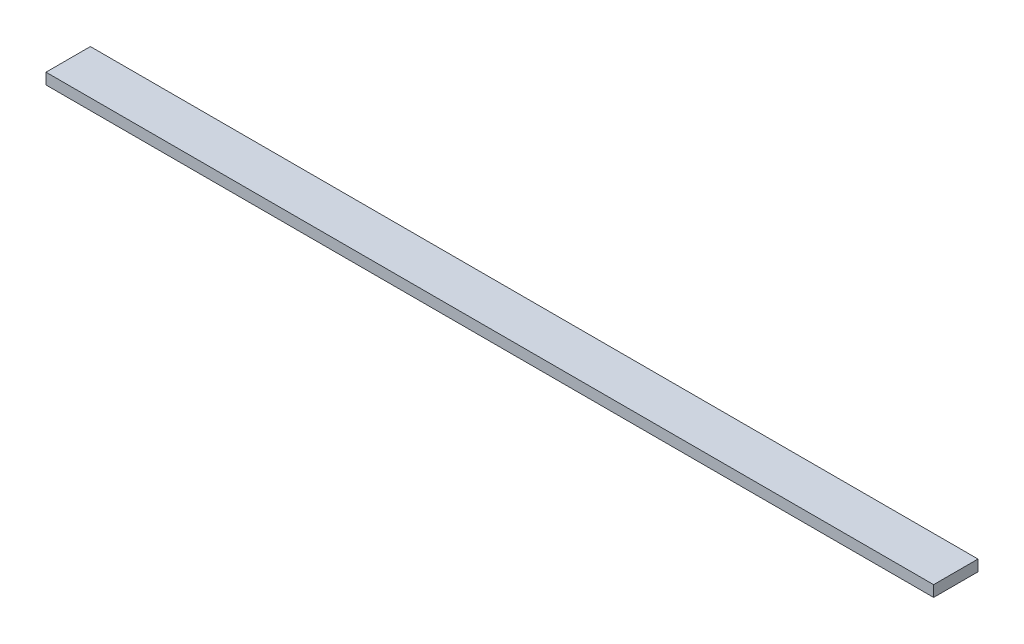
ISO-10303-21;
HEADER;
FILE_DESCRIPTION(('STEP AP214'),'2;1');
FILE_NAME('part.step','',(''),(''),'','','');
FILE_SCHEMA(('AUTOMOTIVE_DESIGN { 1 0 10303 214 1 1 1 1 }'));
ENDSEC;
DATA;
#1=APPLICATION_CONTEXT('core data for automotive mechanical design processes');
#2=APPLICATION_PROTOCOL_DEFINITION('international standard','automotive_design',2000,#1);
#3=PRODUCT_CONTEXT('',#1,'mechanical');
#4=PRODUCT('Part','Part','',(#3));
#5=PRODUCT_RELATED_PRODUCT_CATEGORY('part','',(#4));
#6=PRODUCT_DEFINITION_FORMATION('','',#4);
#7=PRODUCT_DEFINITION_CONTEXT('part definition',#1,'design');
#8=PRODUCT_DEFINITION('design','',#6,#7);
#9=PRODUCT_DEFINITION_SHAPE('','',#8);
#10=(LENGTH_UNIT() NAMED_UNIT(*) SI_UNIT(.MILLI.,.METRE.));
#11=(NAMED_UNIT(*) PLANE_ANGLE_UNIT() SI_UNIT($,.RADIAN.));
#12=(NAMED_UNIT(*) SI_UNIT($,.STERADIAN.) SOLID_ANGLE_UNIT());
#13=UNCERTAINTY_MEASURE_WITH_UNIT(LENGTH_MEASURE(1.E-05),#10,'distance_accuracy_value','');
#14=(GEOMETRIC_REPRESENTATION_CONTEXT(3) GLOBAL_UNCERTAINTY_ASSIGNED_CONTEXT((#13)) GLOBAL_UNIT_ASSIGNED_CONTEXT((#10,
#11,#12)) REPRESENTATION_CONTEXT('',''));
#15=CARTESIAN_POINT('',(0.,0.,0.));
#16=DIRECTION('',(0.,0.,1.));
#17=DIRECTION('',(1.,0.,0.));
#18=AXIS2_PLACEMENT_3D('',#15,#16,#17);
#19=CARTESIAN_POINT('',(254.,6.35,-12.7));
#20=DIRECTION('',(-1.,0.,0.));
#21=DIRECTION('',(0.,0.,1.));
#22=AXIS2_PLACEMENT_3D('',#19,#20,#21);
#23=PLANE('',#22);
#24=DIRECTION('',(0.,0.,-1.));
#25=VECTOR('',#24,1.);
#26=CARTESIAN_POINT('',(254.,0.,-12.7));
#27=LINE('',#26,#25);
#28=CARTESIAN_POINT('',(254.,0.,12.7));
#29=VERTEX_POINT('',#28);
#30=CARTESIAN_POINT('',(254.,0.,-12.7));
#31=VERTEX_POINT('',#30);
#32=EDGE_CURVE('E96',#29,#31,#27,.T.);
#33=ORIENTED_EDGE('',*,*,#32,.T.);
#34=DIRECTION('',(0.,-1.,0.));
#35=VECTOR('',#34,1.);
#36=CARTESIAN_POINT('',(254.,6.35,-12.7));
#37=LINE('',#36,#35);
#38=CARTESIAN_POINT('',(254.,6.35,-12.7));
#39=VERTEX_POINT('',#38);
#40=EDGE_CURVE('E11',#39,#31,#37,.T.);
#41=ORIENTED_EDGE('',*,*,#40,.F.);
#42=DIRECTION('',(0.,0.,-1.));
#43=VECTOR('',#42,1.);
#44=CARTESIAN_POINT('',(254.,6.35,-12.7));
#45=LINE('',#44,#43);
#46=CARTESIAN_POINT('',(254.,6.35,12.7));
#47=VERTEX_POINT('',#46);
#48=EDGE_CURVE('E84',#47,#39,#45,.T.);
#49=ORIENTED_EDGE('',*,*,#48,.F.);
#50=DIRECTION('',(0.,-1.,0.));
#51=VECTOR('',#50,1.);
#52=CARTESIAN_POINT('',(254.,6.35,12.7));
#53=LINE('',#52,#51);
#54=EDGE_CURVE('E92',#47,#29,#53,.T.);
#55=ORIENTED_EDGE('',*,*,#54,.T.);
#56=EDGE_LOOP('',(#33,#41,#49,#55));
#57=FACE_BOUND('',#56,.T.);
#58=ADVANCED_FACE('F33',(#57),#23,.F.);
#59=CARTESIAN_POINT('',(-254.,6.35,-12.7));
#60=DIRECTION('',(0.,0.,1.));
#61=DIRECTION('',(1.,0.,0.));
#62=AXIS2_PLACEMENT_3D('',#59,#60,#61);
#63=PLANE('',#62);
#64=DIRECTION('',(-1.,0.,0.));
#65=VECTOR('',#64,1.);
#66=CARTESIAN_POINT('',(-254.,0.,-12.7));
#67=LINE('',#66,#65);
#68=CARTESIAN_POINT('',(-254.,0.,-12.7));
#69=VERTEX_POINT('',#68);
#70=EDGE_CURVE('E88',#31,#69,#67,.T.);
#71=ORIENTED_EDGE('',*,*,#70,.T.);
#72=DIRECTION('',(0.,-1.,0.));
#73=VECTOR('',#72,1.);
#74=CARTESIAN_POINT('',(-254.,6.35,-12.7));
#75=LINE('',#74,#73);
#76=CARTESIAN_POINT('',(-254.,6.35,-12.7));
#77=VERTEX_POINT('',#76);
#78=EDGE_CURVE('E41',#77,#69,#75,.T.);
#79=ORIENTED_EDGE('',*,*,#78,.F.);
#80=DIRECTION('',(-1.,0.,0.));
#81=VECTOR('',#80,1.);
#82=CARTESIAN_POINT('',(-254.,6.35,-12.7));
#83=LINE('',#82,#81);
#84=EDGE_CURVE('E79',#39,#77,#83,.T.);
#85=ORIENTED_EDGE('',*,*,#84,.F.);
#86=ORIENTED_EDGE('',*,*,#40,.T.);
#87=EDGE_LOOP('',(#71,#79,#85,#86));
#88=FACE_BOUND('',#87,.T.);
#89=ADVANCED_FACE('F87',(#88),#63,.F.);
#90=CARTESIAN_POINT('',(-254.,6.35,-12.7));
#91=DIRECTION('',(1.,0.,0.));
#92=DIRECTION('',(0.,0.,-1.));
#93=AXIS2_PLACEMENT_3D('',#90,#91,#92);
#94=PLANE('',#93);
#95=DIRECTION('',(0.,0.,1.));
#96=VECTOR('',#95,1.);
#97=CARTESIAN_POINT('',(-254.,0.,-12.7));
#98=LINE('',#97,#96);
#99=CARTESIAN_POINT('',(-254.,0.,12.7));
#100=VERTEX_POINT('',#99);
#101=EDGE_CURVE('E66',#69,#100,#98,.T.);
#102=ORIENTED_EDGE('',*,*,#101,.T.);
#103=DIRECTION('',(0.,-1.,0.));
#104=VECTOR('',#103,1.);
#105=CARTESIAN_POINT('',(-254.,6.35,12.7));
#106=LINE('',#105,#104);
#107=CARTESIAN_POINT('',(-254.,6.35,12.7));
#108=VERTEX_POINT('',#107);
#109=EDGE_CURVE('E89',#108,#100,#106,.T.);
#110=ORIENTED_EDGE('',*,*,#109,.F.);
#111=DIRECTION('',(0.,0.,1.));
#112=VECTOR('',#111,1.);
#113=CARTESIAN_POINT('',(-254.,6.35,-12.7));
#114=LINE('',#113,#112);
#115=EDGE_CURVE('E82',#77,#108,#114,.T.);
#116=ORIENTED_EDGE('',*,*,#115,.F.);
#117=ORIENTED_EDGE('',*,*,#78,.T.);
#118=EDGE_LOOP('',(#102,#110,#116,#117));
#119=FACE_BOUND('',#118,.T.);
#120=ADVANCED_FACE('F90',(#119),#94,.F.);
#121=CARTESIAN_POINT('',(-254.,6.35,12.7));
#122=DIRECTION('',(0.,0.,-1.));
#123=DIRECTION('',(-1.,0.,0.));
#124=AXIS2_PLACEMENT_3D('',#121,#122,#123);
#125=PLANE('',#124);
#126=DIRECTION('',(1.,0.,0.));
#127=VECTOR('',#126,1.);
#128=CARTESIAN_POINT('',(-254.,0.,12.7));
#129=LINE('',#128,#127);
#130=EDGE_CURVE('E72',#100,#29,#129,.T.);
#131=ORIENTED_EDGE('',*,*,#130,.T.);
#132=ORIENTED_EDGE('',*,*,#54,.F.);
#133=DIRECTION('',(1.,0.,0.));
#134=VECTOR('',#133,1.);
#135=CARTESIAN_POINT('',(-254.,6.35,12.7));
#136=LINE('',#135,#134);
#137=EDGE_CURVE('E49',#108,#47,#136,.T.);
#138=ORIENTED_EDGE('',*,*,#137,.F.);
#139=ORIENTED_EDGE('',*,*,#109,.T.);
#140=EDGE_LOOP('',(#131,#132,#138,#139));
#141=FACE_BOUND('',#140,.T.);
#142=ADVANCED_FACE('F103',(#141),#125,.F.);
#143=CARTESIAN_POINT('',(0.,6.35,0.));
#144=DIRECTION('',(0.,1.,0.));
#145=DIRECTION('',(0.,0.,1.));
#146=AXIS2_PLACEMENT_3D('',#143,#144,#145);
#147=PLANE('',#146);
#148=ORIENTED_EDGE('',*,*,#48,.T.);
#149=ORIENTED_EDGE('',*,*,#84,.T.);
#150=ORIENTED_EDGE('',*,*,#115,.T.);
#151=ORIENTED_EDGE('',*,*,#137,.T.);
#152=EDGE_LOOP('',(#148,#149,#150,#151));
#153=FACE_BOUND('',#152,.T.);
#154=ADVANCED_FACE('F80',(#153),#147,.T.);
#155=CARTESIAN_POINT('',(0.,0.,0.));
#156=DIRECTION('',(0.,1.,0.));
#157=DIRECTION('',(0.,0.,1.));
#158=AXIS2_PLACEMENT_3D('',#155,#156,#157);
#159=PLANE('',#158);
#160=ORIENTED_EDGE('',*,*,#32,.F.);
#161=ORIENTED_EDGE('',*,*,#130,.F.);
#162=ORIENTED_EDGE('',*,*,#101,.F.);
#163=ORIENTED_EDGE('',*,*,#70,.F.);
#164=EDGE_LOOP('',(#160,#161,#162,#163));
#165=FACE_BOUND('',#164,.T.);
#166=ADVANCED_FACE('F106',(#165),#159,.F.);
#167=CLOSED_SHELL('',(#58,#89,#120,#142,#154,#166));
#168=MANIFOLD_SOLID_BREP('B2',#167);
#169=ADVANCED_BREP_SHAPE_REPRESENTATION('',(#18,#168),#14);
#170=SHAPE_DEFINITION_REPRESENTATION(#9,#169);
ENDSEC;
END-ISO-10303-21;
